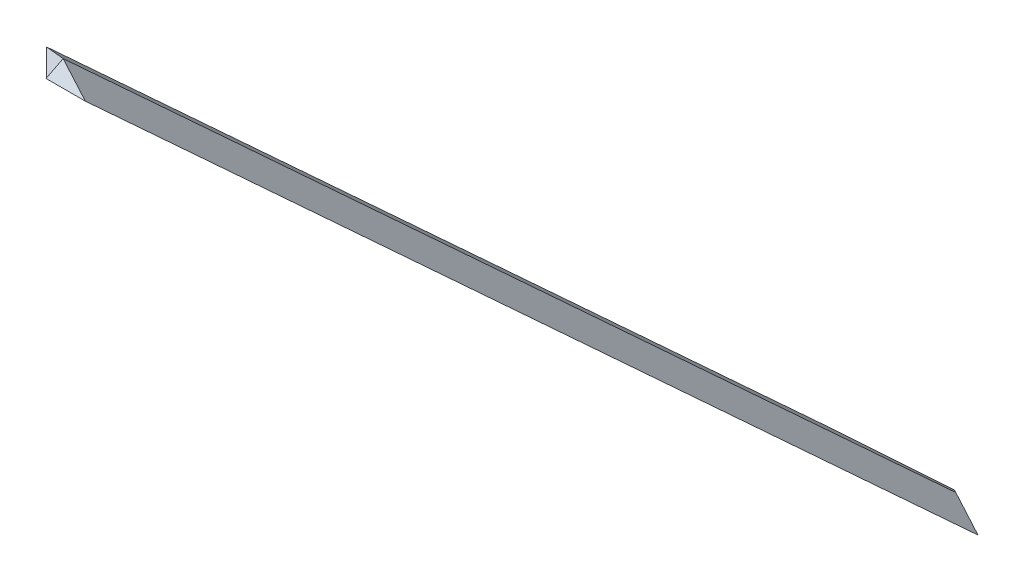
ISO-10303-21;
HEADER;
FILE_DESCRIPTION(('STEP AP214'),'2;1');
FILE_NAME('part.step','',(''),(''),'','','');
FILE_SCHEMA(('AUTOMOTIVE_DESIGN { 1 0 10303 214 1 1 1 1 }'));
ENDSEC;
DATA;
#1=APPLICATION_CONTEXT('core data for automotive mechanical design processes');
#2=APPLICATION_PROTOCOL_DEFINITION('international standard','automotive_design',2000,#1);
#3=PRODUCT_CONTEXT('',#1,'mechanical');
#4=PRODUCT('Part','Part','',(#3));
#5=PRODUCT_RELATED_PRODUCT_CATEGORY('part','',(#4));
#6=PRODUCT_DEFINITION_FORMATION('','',#4);
#7=PRODUCT_DEFINITION_CONTEXT('part definition',#1,'design');
#8=PRODUCT_DEFINITION('design','',#6,#7);
#9=PRODUCT_DEFINITION_SHAPE('','',#8);
#10=(LENGTH_UNIT() NAMED_UNIT(*) SI_UNIT(.MILLI.,.METRE.));
#11=(NAMED_UNIT(*) PLANE_ANGLE_UNIT() SI_UNIT($,.RADIAN.));
#12=(NAMED_UNIT(*) SI_UNIT($,.STERADIAN.) SOLID_ANGLE_UNIT());
#13=UNCERTAINTY_MEASURE_WITH_UNIT(LENGTH_MEASURE(1.E-05),#10,'distance_accuracy_value','');
#14=(GEOMETRIC_REPRESENTATION_CONTEXT(3) GLOBAL_UNCERTAINTY_ASSIGNED_CONTEXT((#13)) GLOBAL_UNIT_ASSIGNED_CONTEXT((#10,
#11,#12)) REPRESENTATION_CONTEXT('',''));
#15=CARTESIAN_POINT('',(0.,0.,0.));
#16=DIRECTION('',(0.,0.,1.));
#17=DIRECTION('',(1.,0.,0.));
#18=AXIS2_PLACEMENT_3D('',#15,#16,#17);
#19=CARTESIAN_POINT('',(-204.997061337424,361.646186737307,597.997319736598));
#20=DIRECTION('',(0.463959634932344,0.757671489646815,-0.458993868074316));
#21=DIRECTION('',(0.852811638118469,-0.522218641844289,0.));
#22=AXIS2_PLACEMENT_3D('',#19,#20,#21);
#23=PLANE('',#22);
#24=DIRECTION('',(0.8827255532639,-0.351898381996991,0.31138902736423));
#25=VECTOR('',#24,1.);
#26=CARTESIAN_POINT('',(153.967453450851,218.545047905128,724.625138207348));
#27=LINE('',#26,#25);
#28=CARTESIAN_POINT('',(-184.121302657974,353.324069319163,605.361423071602));
#29=VERTEX_POINT('',#28);
#30=CARTESIAN_POINT('',(-204.997061337424,361.646186737307,597.997319736598));
#31=VERTEX_POINT('',#30);
#32=EDGE_CURVE('E116',#29,#31,#27,.F.);
#33=ORIENTED_EDGE('',*,*,#32,.F.);
#34=DIRECTION('',(-0.323023809091169,0.62716039849875,0.708749217505826));
#35=VECTOR('',#34,1.);
#36=CARTESIAN_POINT('',(-186.299570780292,357.553242108233,610.140779217375));
#37=LINE('',#36,#35);
#38=CARTESIAN_POINT('',(-14.0492413205163,23.1240693191629,232.204903334985));
#39=VERTEX_POINT('',#38);
#40=EDGE_CURVE('E252',#39,#29,#37,.T.);
#41=ORIENTED_EDGE('',*,*,#40,.F.);
#42=DIRECTION('',(0.8827255532639,-0.351898381996991,0.31138902736423));
#43=VECTOR('',#42,1.);
#44=CARTESIAN_POINT('',(-34.9249999999668,31.4461867373068,224.84079999998));
#45=LINE('',#44,#43);
#46=CARTESIAN_POINT('',(-34.9249999999667,31.4461867373068,224.84079999998));
#47=VERTEX_POINT('',#46);
#48=EDGE_CURVE('E128',#47,#39,#45,.T.);
#49=ORIENTED_EDGE('',*,*,#48,.F.);
#50=DIRECTION('',(-0.323023809091168,0.62716039849875,0.708749217505827));
#51=VECTOR('',#50,1.);
#52=CARTESIAN_POINT('',(-204.997061337424,361.646186737307,597.997319736598));
#53=LINE('',#52,#51);
#54=EDGE_CURVE('E125',#47,#31,#53,.T.);
#55=ORIENTED_EDGE('',*,*,#54,.T.);
#56=EDGE_LOOP('',(#33,#41,#49,#55));
#57=FACE_BOUND('',#56,.T.);
#58=ADVANCED_FACE('F41',(#57),#23,.T.);
#59=CARTESIAN_POINT('',(255.683748074746,361.646186737307,597.997319736598));
#60=DIRECTION('',(0.,0.748896955513514,-0.662686464342369));
#61=DIRECTION('',(0.,0.662686464342369,0.748896955513514));
#62=AXIS2_PLACEMENT_3D('',#59,#60,#61);
#63=PLANE('',#62);
#64=CARTESIAN_POINT('',(-43.5966514882547,24.4970777475195,216.987664549043));
#65=CARTESIAN_POINT('',(-42.4160941460094,25.4427715301388,218.056385932019));
#66=CARTESIAN_POINT('',(-41.2356447898434,26.388524511709,219.125174215282));
#67=CARTESIAN_POINT('',(-39.200139486614,28.0195828922388,220.968420940799));
#68=CARTESIAN_POINT('',(-38.3450322344819,28.7048601737128,221.742847607696));
#69=CARTESIAN_POINT('',(-36.6349310923435,30.075476864595,223.291771151798));
#70=CARTESIAN_POINT('',(-35.7799372023387,30.7608162740041,224.066268029004));
#71=CARTESIAN_POINT('',(-34.9249999999667,31.4461867373069,224.84079999998));
#72=B_SPLINE_CURVE_WITH_KNOTS('',3,(#64,#65,#66,#67,#68,#69,#70,#71),.UNSPECIFIED.,.F.,.F.,(4,2,
2,4),(0.,5.55625411428845,9.58179136848101,13.6073286710563),.UNSPECIFIED.);
#73=CARTESIAN_POINT('',(-43.5966515034369,24.4970777353597,216.987664523026));
#74=VERTEX_POINT('',#73);
#75=EDGE_CURVE('E120',#74,#47,#72,.T.);
#76=ORIENTED_EDGE('',*,*,#75,.F.);
#77=CARTESIAN_POINT('',(-79.1946603762035,68.8938929090914,267.160169191932));
#78=CARTESIAN_POINT('',(-76.2271244139148,65.1945228603428,262.979539111348));
#79=CARTESIAN_POINT('',(-73.25978810328,61.4950824732795,258.798829541967));
#80=CARTESIAN_POINT('',(-67.3255990529741,54.0960314328693,250.437217986567));
#81=CARTESIAN_POINT('',(-64.3587463132979,50.3964207795242,246.25631600055));
#82=CARTESIAN_POINT('',(-58.4256086057138,42.9969995335628,237.89428607866));
#83=CARTESIAN_POINT('',(-55.4593236378065,39.2971889409462,233.713158142786));
#84=CARTESIAN_POINT('',(-49.5274416047969,31.8973255412575,225.350628546317));
#85=CARTESIAN_POINT('',(-46.5618445397021,28.1972727341827,221.169226885718));
#86=CARTESIAN_POINT('',(-43.5966515220956,24.4970777204068,216.987664518403));
#87=B_SPLINE_CURVE_WITH_KNOTS('',3,(#77,#78,#79,#80,#81,#82,#83,#84,#85,#86),.UNSPECIFIED.,.F.,
.F.,(4,2,2,2,4),(0.,18.966377806223,37.9327554079249,56.8991330278336,75.8655108522634),.UNSPECIFIED.);
#88=CARTESIAN_POINT('',(-76.3154179480405,65.3044903294254,263.103812515488));
#89=VERTEX_POINT('',#88);
#90=EDGE_CURVE('E254',#89,#74,#87,.T.);
#91=ORIENTED_EDGE('',*,*,#90,.F.);
#92=DIRECTION('',(0.323023809091169,-0.62716039849875,-0.708749217505826));
#93=VECTOR('',#92,1.);
#94=CARTESIAN_POINT('',(-68.1517852206499,49.4545529241522,245.191918268986));
#95=LINE('',#94,#93);
#96=CARTESIAN_POINT('',(-224.611905791927,353.226562308607,588.482365922839));
#97=VERTEX_POINT('',#96);
#98=EDGE_CURVE('E127',#97,#89,#95,.T.);
#99=ORIENTED_EDGE('',*,*,#98,.F.);
#100=DIRECTION('',(-0.839309853134073,-0.360271719670677,-0.407140342434392));
#101=VECTOR('',#100,1.);
#102=CARTESIAN_POINT('',(-204.997061337424,361.646186737307,597.997319736598));
#103=LINE('',#102,#101);
#104=EDGE_CURVE('E100',#31,#97,#103,.T.);
#105=ORIENTED_EDGE('',*,*,#104,.F.);
#106=ORIENTED_EDGE('',*,*,#54,.F.);
#107=EDGE_LOOP('',(#76,#91,#99,#105,#106));
#108=FACE_BOUND('',#107,.T.);
#109=ADVANCED_FACE('F43',(#108),#63,.T.);
#110=CARTESIAN_POINT('',(-168.099033988959,54.9996375158092,153.316755044734));
#111=DIRECTION('',(0.242961847822242,-0.691643547357536,-0.680146119522479));
#112=DIRECTION('',(-0.970035844957701,-0.173233798703227,-0.170354073869832));
#113=AXIS2_PLACEMENT_3D('',#110,#111,#112);
#114=PLANE('',#113);
#115=CARTESIAN_POINT('',(-34.9249999999667,31.4461867373068,224.84079999998));
#116=CARTESIAN_POINT('',(-35.2862654918904,31.1565740068198,225.006301000408));
#117=CARTESIAN_POINT('',(-35.6475276128992,30.8669570714235,225.171802000837));
#118=CARTESIAN_POINT('',(-36.3700451130869,30.2877147908123,225.502804001694));
#119=CARTESIAN_POINT('',(-36.7313004922657,29.9980894455975,225.668305002122));
#120=CARTESIAN_POINT('',(-37.4538045087935,29.4188303453492,225.999307002979));
#121=CARTESIAN_POINT('',(-37.8150531461424,29.1291965903159,226.164808003408));
#122=CARTESIAN_POINT('',(-38.5375436790103,28.5499206704306,226.495810004265));
#123=CARTESIAN_POINT('',(-38.8987855745292,28.2602785055786,226.661311004693));
#124=CARTESIAN_POINT('',(-39.6212626237372,27.6809857660563,226.99231300555));
#125=CARTESIAN_POINT('',(-39.9824977774263,27.3913351913858,227.157814005978));
#126=CARTESIAN_POINT('',(-40.7049613429744,26.8120256322263,227.488816006835));
#127=CARTESIAN_POINT('',(-41.0661897548335,26.5223666477373,227.654317007264));
#128=CARTESIAN_POINT('',(-41.7886398367218,25.9430402689408,227.985319008121));
#129=CARTESIAN_POINT('',(-42.1498615067509,25.6533728746333,228.150820008549));
#130=CARTESIAN_POINT('',(-42.8722981049793,25.0740296761997,228.481822009406));
#131=CARTESIAN_POINT('',(-43.2335130331785,24.7843538720736,228.647323009834));
#132=CARTESIAN_POINT('',(-43.5947245897685,24.4946738635951,228.812824009945));
#133=B_SPLINE_CURVE_WITH_KNOTS('',3,(#115,#116,#117,#118,#119,#120,#121,#122,#123,#124,#125,
#126,#127,#128,#129,#130,#131,#132),.UNSPECIFIED.,.F.,.F.,(4,2,2,2,2,2,2,2,4),(0.,
1.47513044644665,2.95026089360212,4.42539134217523,5.90052179287481,7.37565224640962,
8.85078270348849,10.3259131648203,11.8010436311138),.UNSPECIFIED.);
#134=CARTESIAN_POINT('',(-43.594724657528,24.4946739082837,228.812823940295));
#135=VERTEX_POINT('',#134);
#136=EDGE_CURVE('E190',#47,#135,#133,.T.);
#137=ORIENTED_EDGE('',*,*,#136,.F.);
#138=DIRECTION('',(-0.266747838828597,-0.721761690426381,0.638674919433295));
#139=VECTOR('',#138,1.);
#140=CARTESIAN_POINT('',(-34.9249999999667,31.4461867373068,224.84079999998));
#141=LINE('',#140,#139);
#142=CARTESIAN_POINT('',(-38.0006783924515,23.1240693191629,232.204903334985));
#143=VERTEX_POINT('',#142);
#144=EDGE_CURVE('E113',#47,#143,#141,.T.);
#145=ORIENTED_EDGE('',*,*,#144,.T.);
#146=DIRECTION('',(0.836909777881261,-0.205052358863252,0.507479609256722));
#147=VECTOR('',#146,1.);
#148=CARTESIAN_POINT('',(-168.099033988959,54.9996375158092,153.316755044734));
#149=LINE('',#148,#147);
#150=EDGE_CURVE('E104',#135,#143,#149,.T.);
#151=ORIENTED_EDGE('',*,*,#150,.F.);
#152=EDGE_LOOP('',(#137,#145,#151));
#153=FACE_BOUND('',#152,.T.);
#154=ADVANCED_FACE('F219',(#153),#114,.T.);
#155=CARTESIAN_POINT('',(-204.997061337424,361.646186737307,597.997319736598));
#156=DIRECTION('',(-0.538629373082569,0.652636126625225,0.532864414908992));
#157=DIRECTION('',(-0.703292155228625,0.,-0.710900938523699));
#158=AXIS2_PLACEMENT_3D('',#155,#156,#157);
#159=PLANE('',#158);
#160=DIRECTION('',(-0.262673661989747,-0.731001575863139,0.629793016301788));
#161=VECTOR('',#160,1.);
#162=CARTESIAN_POINT('',(-204.997061337424,361.646186737307,597.997319736598));
#163=LINE('',#162,#161);
#164=CARTESIAN_POINT('',(-208.02251799072,353.226562308607,605.251231137292));
#165=VERTEX_POINT('',#164);
#166=EDGE_CURVE('E61',#31,#165,#163,.T.);
#167=ORIENTED_EDGE('',*,*,#166,.F.);
#168=ORIENTED_EDGE('',*,*,#104,.T.);
#169=DIRECTION('',(-0.703292155228625,0.,-0.710900938523699));
#170=VECTOR('',#169,1.);
#171=CARTESIAN_POINT('',(-210.15281278061,353.226562308607,603.097889095574));
#172=LINE('',#171,#170);
#173=EDGE_CURVE('E102',#165,#97,#172,.T.);
#174=ORIENTED_EDGE('',*,*,#173,.F.);
#175=EDGE_LOOP('',(#167,#168,#174));
#176=FACE_BOUND('',#175,.T.);
#177=ADVANCED_FACE('F98',(#176),#159,.T.);
#178=CARTESIAN_POINT('',(-43.5944602670922,24.4943440282974,230.435347275977));
#179=CARTESIAN_POINT('',(-43.594548393661,24.4944539581619,229.894506164077));
#180=CARTESIAN_POINT('',(-43.5946365202298,24.4945638880263,229.353665052176));
#181=CARTESIAN_POINT('',(-43.5947246467985,24.4946738178908,228.812823940275));
#182=CARTESIAN_POINT('',(-43.5949403853541,24.494942932081,227.488815960177));
#183=CARTESIAN_POINT('',(-43.5951561239097,24.4952120462711,226.164807980078));
#184=CARTESIAN_POINT('',(-43.5953718624653,24.4954811604613,224.84079999998));
#185=CARTESIAN_POINT('',(-43.6037652800673,24.505951184116,173.329599999988));
#186=CARTESIAN_POINT('',(-43.6121641093435,24.5164668180097,121.818399999996));
#187=CARTESIAN_POINT('',(-43.6205680635586,24.5270283852065,70.3072000000032));
#188=CARTESIAN_POINT('',(-43.6207718197397,24.5272844533078,69.0582967900304));
#189=CARTESIAN_POINT('',(-43.6209755759208,24.527540521409,67.8093935800576));
#190=CARTESIAN_POINT('',(-43.6211793321019,24.5277965895102,66.5604903700848));
#191=CARTESIAN_POINT('',(-43.6212684516717,24.527908589445,66.0142408470651));
#192=CARTESIAN_POINT('',(-43.6213575712414,24.5280205893799,65.4679913240455));
#193=CARTESIAN_POINT('',(-43.6214466908112,24.5281325893147,64.9217418010259));
#194=CARTESIAN_POINT('',(-34.9249999999667,31.4461867373069,230.435347275977));
#195=CARTESIAN_POINT('',(-34.9249999999667,31.4461867373069,229.894506164077));
#196=CARTESIAN_POINT('',(-34.9249999999667,31.4461867373069,229.353665052176));
#197=CARTESIAN_POINT('',(-34.9249999999667,31.4461867373069,228.812823940275));
#198=CARTESIAN_POINT('',(-34.9249999999667,31.4461867373069,227.488815960177));
#199=CARTESIAN_POINT('',(-34.9249999999667,31.4461867373069,226.164807980079));
#200=CARTESIAN_POINT('',(-34.9249999999667,31.4461867373069,224.84079999998));
#201=CARTESIAN_POINT('',(-34.9249999999667,31.4461867373069,173.329599999988));
#202=CARTESIAN_POINT('',(-34.9249999999667,31.446186737307,121.818399999996));
#203=CARTESIAN_POINT('',(-34.9249999999667,31.446186737307,70.3072000000032));
#204=CARTESIAN_POINT('',(-34.9249999999667,31.446186737307,69.0582967900304));
#205=CARTESIAN_POINT('',(-34.9249999999667,31.446186737307,67.8093935800576));
#206=CARTESIAN_POINT('',(-34.9249999999667,31.446186737307,66.5604903700848));
#207=CARTESIAN_POINT('',(-34.9249999999667,31.446186737307,66.0142408470651));
#208=CARTESIAN_POINT('',(-34.9249999999667,31.446186737307,65.4679913240455));
#209=CARTESIAN_POINT('',(-34.9249999999667,31.446186737307,64.9217418010259));
#210=B_SPLINE_SURFACE_WITH_KNOTS('',1,3,((#178,#179,#180,#181,#182,#183,#184,#185,#186,#187,
#188,#189,#190,#191,#192,#193),(#194,#195,#196,#197,#198,#199,#200,#201,#202,#203,#204,#205,
#206,#207,#208,#209)),.UNSPECIFIED.,.F.,.F.,.F.,(2,2),(4,3,3,3,3,4),(0.,1.),
(-0.0362027887527238,-0.0257033029729183,0.,1.,1.02424527500763,1.03484975564523),.UNSPECIFIED.);
#211=CARTESIAN_POINT('',(-43.5966515217745,24.4970777200063,216.987664522559));
#212=CARTESIAN_POINT('',(-43.5965712320807,24.4969775281336,217.480379498104));
#213=CARTESIAN_POINT('',(-43.5964909426451,24.4968773401416,217.97309447365));
#214=CARTESIAN_POINT('',(-43.5963303646211,24.4966769723303,218.958524425027));
#215=CARTESIAN_POINT('',(-43.5962500760327,24.496576792511,219.451239400859));
#216=CARTESIAN_POINT('',(-43.5960895000338,24.4963764414566,220.436669352392));
#217=CARTESIAN_POINT('',(-43.5960092126233,24.4962762702214,220.929384328094));
#218=CARTESIAN_POINT('',(-43.5958486386607,24.4960759359356,221.914814279562));
#219=CARTESIAN_POINT('',(-43.5957683521086,24.4959757728849,222.407529255328));
#220=CARTESIAN_POINT('',(-43.5956077799948,24.4957754551313,223.392959206862));
#221=CARTESIAN_POINT('',(-43.5955274944331,24.4956753004284,223.885674182628));
#222=CARTESIAN_POINT('',(-43.595366924338,24.4954749994167,224.871104134162));
#223=CARTESIAN_POINT('',(-43.5952866398046,24.4953748531078,225.363819109928));
#224=CARTESIAN_POINT('',(-43.595126071752,24.4951745688653,226.349249061461));
#225=CARTESIAN_POINT('',(-43.5950457882327,24.4950744309316,226.841964037228));
#226=CARTESIAN_POINT('',(-43.5948852220522,24.4948741632432,227.827393989112));
#227=CARTESIAN_POINT('',(-43.5948049393909,24.4947740334886,228.320108965229));
#228=CARTESIAN_POINT('',(-43.5947246570805,24.4946739077256,228.812823941348));
#229=B_SPLINE_CURVE_WITH_KNOTS('',3,(#211,#212,#213,#214,#215,#216,#217,#218,#219,#220,#221,
#222,#223,#224,#225,#226,#227,#228),.UNSPECIFIED.,.F.,.F.,(4,2,2,2,2,2,2,2,4),(0.,
1.47814497682027,2.9562899544926,4.43443493176986,5.91257990923636,7.39072488669721,
8.86886986415254,10.3470148416022,11.8251598200987),.UNSPECIFIED.);
#230=EDGE_CURVE('E70',#74,#135,#229,.T.);
#231=ORIENTED_EDGE('',*,*,#230,.F.);
#232=ORIENTED_EDGE('',*,*,#75,.T.);
#233=ORIENTED_EDGE('',*,*,#136,.T.);
#234=EDGE_LOOP('',(#231,#232,#233));
#235=FACE_BOUND('',#234,.T.);
#236=ADVANCED_FACE('F149',(#235),#210,.F.);
#237=CARTESIAN_POINT('',(-176.629416605842,73.2006774319318,174.738949338658));
#238=DIRECTION('',(-0.463959634932344,-0.757671489646815,0.458993868074316));
#239=DIRECTION('',(-0.852811638118469,0.522218641844289,0.));
#240=AXIS2_PLACEMENT_3D('',#237,#238,#239);
#241=PLANE('',#240);
#242=ORIENTED_EDGE('',*,*,#173,.T.);
#243=ORIENTED_EDGE('',*,*,#98,.T.);
#244=CARTESIAN_POINT('',(-414.971545492337,487.729864730061,618.090884711644));
#245=CARTESIAN_POINT('',(-394.959422494721,462.766907206958,597.112600246272));
#246=CARTESIAN_POINT('',(-374.947273336425,437.803949159983,576.134341359839));
#247=CARTESIAN_POINT('',(-334.922878080978,387.87803145122,534.177918908985));
#248=CARTESIAN_POINT('',(-314.910631983828,362.915071789433,513.199755344563));
#249=CARTESIAN_POINT('',(-274.88599769682,312.98914961493,471.24356713961));
#250=CARTESIAN_POINT('',(-254.873609506961,288.026187102215,450.265542499079));
#251=CARTESIAN_POINT('',(-224.854847293275,250.581739585816,418.798681228003));
#252=CARTESIAN_POINT('',(-214.848563173958,238.10025638103,408.309756689769));
#253=CARTESIAN_POINT('',(-194.835914029149,213.137288329046,387.331986683614));
#254=CARTESIAN_POINT('',(-184.829549003657,200.655803481847,376.843141215694));
#255=CARTESIAN_POINT('',(-168.152181016487,179.853326760873,359.36182279149));
#256=CARTESIAN_POINT('',(-161.481209004612,171.532335506033,352.369319572255));
#257=CARTESIAN_POINT('',(-148.139202146865,154.890351756533,338.384374600971));
#258=CARTESIAN_POINT('',(-141.468167300991,146.569359261873,331.391932848922));
#259=CARTESIAN_POINT('',(-128.126016775031,129.927372718056,317.407128487528));
#260=CARTESIAN_POINT('',(-121.454901094944,121.6063786689,310.414765878182));
#261=CARTESIAN_POINT('',(-108.11256339683,104.964388796083,296.430145218666));
#262=CARTESIAN_POINT('',(-101.441341378807,96.6433929724231,289.437887168492));
#263=CARTESIAN_POINT('',(-88.098752617887,80.001398377159,275.453512492533));
#264=CARTESIAN_POINT('',(-81.4273858749886,71.6803996055548,268.461395866748));
#265=CARTESIAN_POINT('',(-68.0844497959861,55.0383978005999,254.47736036524));
#266=CARTESIAN_POINT('',(-61.4128804598765,46.717394767249,247.485441489523));
#267=CARTESIAN_POINT('',(-49.7373719866416,32.1556327904267,235.249837420276));
#268=CARTESIAN_POINT('',(-44.7334980887159,25.9148751467401,230.006088427319));
#269=CARTESIAN_POINT('',(-34.7255179202135,13.4333552691537,219.518817750886));
#270=CARTESIAN_POINT('',(-29.721411649638,7.19259303525407,214.275296067407));
#271=CARTESIAN_POINT('',(-19.7128652117183,-5.28893781751252,203.788579669774));
#272=CARTESIAN_POINT('',(-14.7084250443875,-11.5297064363792,198.545384955608));
#273=CARTESIAN_POINT('',(-4.69904486216082,-24.0112531419131,188.059485153883));
#274=CARTESIAN_POINT('',(0.305895152699374,-30.2520312285796,182.816780066291));
#275=CARTESIAN_POINT('',(7.8139178170211,-39.6132112357396,174.953320448372));
#276=CARTESIAN_POINT('',(10.3166944697198,-42.7336071218743,172.332266571815));
#277=CARTESIAN_POINT('',(15.3225191553431,-48.9744041938665,167.090424386566));
#278=CARTESIAN_POINT('',(17.8255671882644,-52.0948053797239,164.469636077871));
#279=CARTESIAN_POINT('',(22.8320282746587,-58.3356148469801,159.22841671735));
#280=CARTESIAN_POINT('',(25.3354413281257,-61.4560231283789,156.607985665518));
#281=CARTESIAN_POINT('',(30.3427758067157,-67.6968497247296,151.367620870875));
#282=CARTESIAN_POINT('',(32.8466972318605,-70.817268039682,148.747687128085));
#283=CARTESIAN_POINT('',(37.8552797919611,-77.0581192079575,143.508543356279));
#284=CARTESIAN_POINT('',(40.3599409269791,-80.1785520612818,140.889333327324));
#285=CARTESIAN_POINT('',(45.370384699843,-86.4194388497168,135.652012105389));
#286=CARTESIAN_POINT('',(47.8761673375566,-89.539892784825,133.033900912279));
#287=CARTESIAN_POINT('',(51.6362422038482,-94.2206013784161,129.108104478471));
#288=CARTESIAN_POINT('',(52.8898346024863,-95.7808429687939,127.799733408322));
#289=CARTESIAN_POINT('',(55.3976485463692,-98.9013376265934,125.183608275832));
#290=CARTESIAN_POINT('',(56.6518700915758,-100.461590694015,123.875854213455));
#291=CARTESIAN_POINT('',(59.1611700571889,-103.582112906483,121.261185694569));
#292=CARTESIAN_POINT('',(60.4162484779376,-105.142382051537,119.954271238397));
#293=CARTESIAN_POINT('',(62.2997811643663,-107.482801882811,117.994797910017));
#294=CARTESIAN_POINT('',(62.9277779660646,-108.262944591224,117.341789793757));
#295=CARTESIAN_POINT('',(64.1841472101208,-109.8232364609,116.036142614019));
#296=CARTESIAN_POINT('',(64.812519652502,-110.603385622162,115.383503550564));
#297=CARTESIAN_POINT('',(65.4411152087394,-111.38353852887,114.731083832099));
#298=B_SPLINE_CURVE_WITH_KNOTS('',3,(#244,#245,#246,#247,#248,#249,#250,#251,#252,#253,#254,
#255,#256,#257,#258,#259,#260,#261,#262,#263,#264,#265,#266,#267,#268,#269,#270,#271,#272,#273,
#274,#275,#276,#277,#278,#279,#280,#281,#282,#283,#284,#285,#286,#287,#288,#289,#290,#291,#292,
#293,#294,#295,#296,#297),.UNSPECIFIED.,.F.,.F.,(4,2,2,2,2,2,2,2,2,2,2,2,2,2,2,2,2,2,2,2,2,2,2,
2,2,2,4),(0.,114.775888620311,229.551775718308,344.327662847868,401.715607100161,
459.103551464102,497.362181586454,535.62081163213,573.879441392565,612.138069518392,
650.396697917814,688.655327345433,717.349306171822,746.043284839191,774.737262354491,
803.431237818932,817.778229268212,832.125220548161,846.47221158934,860.819203247916,
875.166196115405,889.513187290289,896.68669002578,903.860192328331,911.033697497314,
914.620450808581,918.207204341138),.UNSPECIFIED.);
#299=EDGE_CURVE('E197',#89,#135,#298,.T.);
#300=ORIENTED_EDGE('',*,*,#299,.T.);
#301=ORIENTED_EDGE('',*,*,#150,.T.);
#302=DIRECTION('',(-0.323023809091169,0.62716039849875,0.708749217505826));
#303=VECTOR('',#302,1.);
#304=CARTESIAN_POINT('',(-49.4542946635174,45.3616082950781,257.335377749763));
#305=LINE('',#304,#303);
#306=EDGE_CURVE('E248',#143,#165,#305,.T.);
#307=ORIENTED_EDGE('',*,*,#306,.T.);
#308=EDGE_LOOP('',(#242,#243,#300,#301,#307));
#309=FACE_BOUND('',#308,.T.);
#310=ADVANCED_FACE('F160',(#309),#241,.T.);
#311=CARTESIAN_POINT('',(-49.4542946635174,45.3616082950781,257.335377749763));
#312=DIRECTION('',(0.915504592812379,0.0173142784285261,0.401934766226983));
#313=DIRECTION('',(0.0158536779420488,-0.999850096645742,0.00696025381795233));
#314=AXIS2_PLACEMENT_3D('',#311,#312,#313);
#315=PLANE('',#314);
#316=DIRECTION('',(-0.26674783882861,-0.721761690426382,0.638674919433288));
#317=VECTOR('',#316,1.);
#318=CARTESIAN_POINT('',(-204.997061337424,361.646186737307,597.997319736598));
#319=LINE('',#318,#317);
#320=CARTESIAN_POINT('',(-208.072739729909,353.324069319163,605.361423071602));
#321=VERTEX_POINT('',#320);
#322=EDGE_CURVE('E105',#31,#321,#319,.T.);
#323=ORIENTED_EDGE('',*,*,#322,.F.);
#324=ORIENTED_EDGE('',*,*,#166,.T.);
#325=DIRECTION('',(-0.323023809091169,0.62716039849875,0.708749217505826));
#326=VECTOR('',#325,1.);
#327=CARTESIAN_POINT('',(-49.4542946635174,45.3616082950781,257.335377749763));
#328=LINE('',#327,#326);
#329=EDGE_CURVE('E110',#165,#321,#328,.T.);
#330=ORIENTED_EDGE('',*,*,#329,.T.);
#331=EDGE_LOOP('',(#323,#324,#330));
#332=FACE_BOUND('',#331,.T.);
#333=ADVANCED_FACE('F109',(#332),#315,.F.);
#334=CARTESIAN_POINT('',(255.683748074746,361.646186737307,597.997319736598));
#335=DIRECTION('',(0.,-0.662686464342369,-0.748896955513514));
#336=DIRECTION('',(1.,0.,0.));
#337=AXIS2_PLACEMENT_3D('',#334,#335,#336);
#338=PLANE('',#337);
#339=DIRECTION('',(-1.,0.,0.));
#340=VECTOR('',#339,1.);
#341=CARTESIAN_POINT('',(25.3663774091317,353.324069319163,605.361423071602));
#342=LINE('',#341,#340);
#343=EDGE_CURVE('E11',#29,#321,#342,.T.);
#344=ORIENTED_EDGE('',*,*,#343,.F.);
#345=ORIENTED_EDGE('',*,*,#32,.T.);
#346=ORIENTED_EDGE('',*,*,#322,.T.);
#347=EDGE_LOOP('',(#344,#345,#346));
#348=FACE_BOUND('',#347,.T.);
#349=ADVANCED_FACE('F117',(#348),#338,.F.);
#350=CARTESIAN_POINT('',(-34.9249999999667,31.4461867373069,224.84079999998));
#351=DIRECTION('',(0.,-0.662686464342369,-0.748896955513514));
#352=DIRECTION('',(1.,0.,0.));
#353=AXIS2_PLACEMENT_3D('',#350,#351,#352);
#354=PLANE('',#353);
#355=ORIENTED_EDGE('',*,*,#144,.F.);
#356=ORIENTED_EDGE('',*,*,#48,.T.);
#357=DIRECTION('',(1.,0.,0.));
#358=VECTOR('',#357,1.);
#359=CARTESIAN_POINT('',(25.9460268023569,23.1240693191629,232.204903334985));
#360=LINE('',#359,#358);
#361=EDGE_CURVE('E53',#143,#39,#360,.T.);
#362=ORIENTED_EDGE('',*,*,#361,.F.);
#363=EDGE_LOOP('',(#355,#356,#362));
#364=FACE_BOUND('',#363,.T.);
#365=ADVANCED_FACE('F232',(#364),#354,.T.);
#366=CARTESIAN_POINT('',(-204.997061337424,353.324069319163,605.361423071602));
#367=DIRECTION('',(0.,-0.748896955513514,0.662686464342369));
#368=DIRECTION('',(0.323023809091168,-0.62716039849875,-0.708749217505826));
#369=AXIS2_PLACEMENT_3D('',#366,#367,#368);
#370=PLANE('',#369);
#371=ORIENTED_EDGE('',*,*,#361,.T.);
#372=ORIENTED_EDGE('',*,*,#40,.T.);
#373=ORIENTED_EDGE('',*,*,#343,.T.);
#374=ORIENTED_EDGE('',*,*,#329,.F.);
#375=ORIENTED_EDGE('',*,*,#306,.F.);
#376=EDGE_LOOP('',(#371,#372,#373,#374,#375));
#377=FACE_BOUND('',#376,.T.);
#378=ADVANCED_FACE('F230',(#377),#370,.T.);
#379=CARTESIAN_POINT('',(-34.9249999999667,31.4461867373069,228.812823940295));
#380=CARTESIAN_POINT('',(-34.9249999999667,31.4461867373069,228.00392796019));
#381=CARTESIAN_POINT('',(-34.9249999999667,31.4461867373069,227.195031980085));
#382=CARTESIAN_POINT('',(-34.9249999999667,31.4461867373069,225.87102399998));
#383=CARTESIAN_POINT('',(-34.9249999999667,31.4461867373069,225.35591199998));
#384=CARTESIAN_POINT('',(-34.9249999999667,31.4461867373069,173.329599999988));
#385=CARTESIAN_POINT('',(-34.9249999999667,31.446186737307,121.818399999995));
#386=CARTESIAN_POINT('',(-34.9249999999667,31.446186737307,69.7869368800033));
#387=CARTESIAN_POINT('',(-34.9249999999667,31.446186737307,69.2666737600033));
#388=CARTESIAN_POINT('',(-34.9249999999667,31.446186737307,66.168720257839));
#389=CARTESIAN_POINT('',(-34.9249999999667,31.446186737307,63.5910298756746));
#390=CARTESIAN_POINT('',(-34.9249999999667,31.446186737307,61.0133394935102));
#391=CARTESIAN_POINT('',(-123.178073263814,141.512853403973,323.91904671838));
#392=CARTESIAN_POINT('',(-123.174644758222,141.512853403973,322.579127126836));
#393=CARTESIAN_POINT('',(-123.171216252631,141.512853403973,321.239207535292));
#394=CARTESIAN_POINT('',(-123.165604444841,141.512853403973,319.046015486454));
#395=CARTESIAN_POINT('',(-123.163421142642,141.512853403973,318.19274302916));
#396=CARTESIAN_POINT('',(-122.942907620536,141.512853403973,232.012224842495));
#397=CARTESIAN_POINT('',(-122.724577400629,141.512853403974,146.684979113124));
#398=CARTESIAN_POINT('',(-122.504042045501,141.512853403974,60.4959282018859));
#399=CARTESIAN_POINT('',(-122.50183691028,141.512853403974,59.6341230200192));
#400=CARTESIAN_POINT('',(-122.488706234438,141.512853403974,54.502426617346));
#401=CARTESIAN_POINT('',(-122.477780693818,141.512853403974,50.2325353965394));
#402=CARTESIAN_POINT('',(-122.466855153198,141.512853403974,45.9626441757327));
#403=CARTESIAN_POINT('',(-211.431146527661,251.57952007064,419.025269496464));
#404=CARTESIAN_POINT('',(-211.424289516478,251.57952007064,417.154326293481));
#405=CARTESIAN_POINT('',(-211.417432505296,251.57952007064,415.283383090498));
#406=CARTESIAN_POINT('',(-211.406208889715,251.57952007064,412.221006972928));
#407=CARTESIAN_POINT('',(-211.401842285316,251.57952007064,411.02957405834));
#408=CARTESIAN_POINT('',(-210.960815241104,251.57952007064,290.694849685003));
#409=CARTESIAN_POINT('',(-210.524154801291,251.57952007064,171.551558226252));
#410=CARTESIAN_POINT('',(-210.083084091035,251.57952007064,51.2049195237685));
#411=CARTESIAN_POINT('',(-210.078673820592,251.57952007064,50.0015722800351));
#412=CARTESIAN_POINT('',(-210.05241246891,251.57952007064,42.8361329768529));
#413=CARTESIAN_POINT('',(-210.03056138767,251.57952007064,36.874040917404));
#414=CARTESIAN_POINT('',(-210.00871030643,251.57952007064,30.9119488579552));
#415=CARTESIAN_POINT('',(-299.684219791508,361.646186737307,514.131492274549));
#416=CARTESIAN_POINT('',(-299.673934274734,361.646186737307,511.729525460127));
#417=CARTESIAN_POINT('',(-299.66364875796,361.646186737307,509.327558645705));
#418=CARTESIAN_POINT('',(-299.646813334589,361.646186737307,505.395998459402));
#419=CARTESIAN_POINT('',(-299.640263427991,361.646186737307,503.866405087521));
#420=CARTESIAN_POINT('',(-298.978722861673,361.646186737307,349.37747452751));
#421=CARTESIAN_POINT('',(-298.323732201952,361.646186737307,196.418137339381));
#422=CARTESIAN_POINT('',(-297.662126136568,361.646186737307,41.9139108456511));
#423=CARTESIAN_POINT('',(-297.655510730905,361.646186737307,40.369021540051));
#424=CARTESIAN_POINT('',(-297.616118703382,361.646186737307,31.1698393363599));
#425=CARTESIAN_POINT('',(-297.583342081522,361.646186737307,23.5155464382688));
#426=CARTESIAN_POINT('',(-297.550565459662,361.646186737307,15.8612535401778));
#427=B_SPLINE_SURFACE_WITH_KNOTS('',3,3,((#379,#380,#381,#382,#383,#384,#385,#386,#387,#388,
#389,#390),(#391,#392,#393,#394,#395,#396,#397,#398,#399,#400,#401,#402),(#403,#404,#405,#406,
#407,#408,#409,#410,#411,#412,#413,#414),(#415,#416,#417,#418,#419,#420,#421,#422,#423,#424,
#425,#426)),.UNSPECIFIED.,.F.,.F.,.F.,(4,4),(4,2,2,2,2,4),(0.,1.),(-0.0257033029730483,-0.01,0.,
1.,1.0101,1.06014135764969),.UNSPECIFIED.);
#428=OFFSET_SURFACE('',#427,11.1125,.F.);
#429=ORIENTED_EDGE('',*,*,#299,.F.);
#430=ORIENTED_EDGE('',*,*,#90,.T.);
#431=ORIENTED_EDGE('',*,*,#230,.T.);
#432=EDGE_LOOP('',(#429,#430,#431));
#433=FACE_BOUND('',#432,.T.);
#434=ADVANCED_FACE('F163',(#433),#428,.T.);
#435=CLOSED_SHELL('',(#58,#109,#154,#177,#236,#310,#333,#349,#365,#378,#434));
#436=MANIFOLD_SOLID_BREP('B2',#435);
#437=ADVANCED_BREP_SHAPE_REPRESENTATION('',(#18,#436),#14);
#438=SHAPE_DEFINITION_REPRESENTATION(#9,#437);
ENDSEC;
END-ISO-10303-21;
